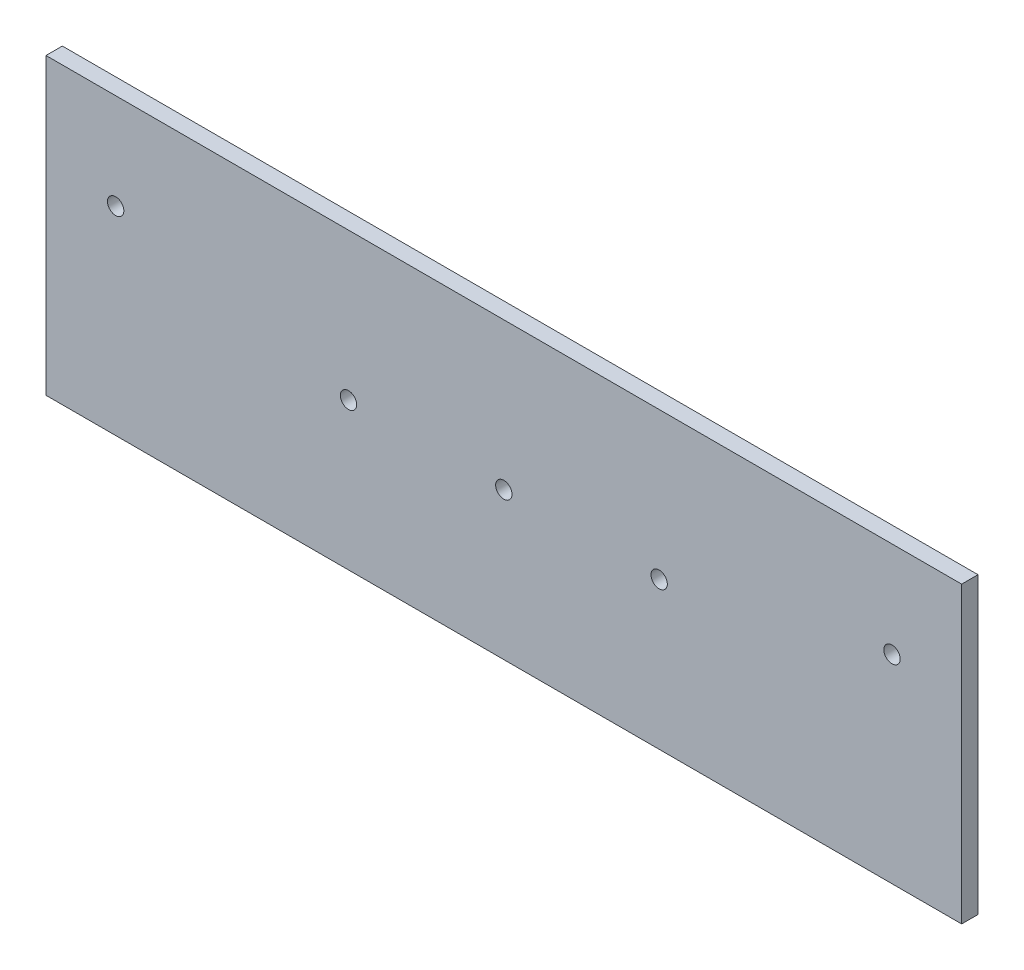
ISO-10303-21;
HEADER;
FILE_DESCRIPTION(('STEP AP214'),'2;1');
FILE_NAME('part.step','',(''),(''),'','','');
FILE_SCHEMA(('AUTOMOTIVE_DESIGN { 1 0 10303 214 1 1 1 1 }'));
ENDSEC;
DATA;
#1=APPLICATION_CONTEXT('core data for automotive mechanical design processes');
#2=APPLICATION_PROTOCOL_DEFINITION('international standard','automotive_design',2000,#1);
#3=PRODUCT_CONTEXT('',#1,'mechanical');
#4=PRODUCT('Part','Part','',(#3));
#5=PRODUCT_RELATED_PRODUCT_CATEGORY('part','',(#4));
#6=PRODUCT_DEFINITION_FORMATION('','',#4);
#7=PRODUCT_DEFINITION_CONTEXT('part definition',#1,'design');
#8=PRODUCT_DEFINITION('design','',#6,#7);
#9=PRODUCT_DEFINITION_SHAPE('','',#8);
#10=(LENGTH_UNIT() NAMED_UNIT(*) SI_UNIT(.MILLI.,.METRE.));
#11=(NAMED_UNIT(*) PLANE_ANGLE_UNIT() SI_UNIT($,.RADIAN.));
#12=(NAMED_UNIT(*) SI_UNIT($,.STERADIAN.) SOLID_ANGLE_UNIT());
#13=UNCERTAINTY_MEASURE_WITH_UNIT(LENGTH_MEASURE(1.E-05),#10,'distance_accuracy_value','');
#14=(GEOMETRIC_REPRESENTATION_CONTEXT(3) GLOBAL_UNCERTAINTY_ASSIGNED_CONTEXT((#13)) GLOBAL_UNIT_ASSIGNED_CONTEXT((#10,
#11,#12)) REPRESENTATION_CONTEXT('',''));
#15=CARTESIAN_POINT('',(0.,0.,0.));
#16=DIRECTION('',(0.,0.,1.));
#17=DIRECTION('',(1.,0.,0.));
#18=AXIS2_PLACEMENT_3D('',#15,#16,#17);
#19=CARTESIAN_POINT('',(177.8,-57.15,6.35));
#20=DIRECTION('',(-1.,0.,0.));
#21=DIRECTION('',(0.,0.,1.));
#22=AXIS2_PLACEMENT_3D('',#19,#20,#21);
#23=PLANE('',#22);
#24=DIRECTION('',(0.,1.,0.));
#25=VECTOR('',#24,1.);
#26=CARTESIAN_POINT('',(177.8,-57.15,0.));
#27=LINE('',#26,#25);
#28=CARTESIAN_POINT('',(177.8,-57.15,0.));
#29=VERTEX_POINT('',#28);
#30=CARTESIAN_POINT('',(177.8,57.15,0.));
#31=VERTEX_POINT('',#30);
#32=EDGE_CURVE('E114',#29,#31,#27,.T.);
#33=ORIENTED_EDGE('',*,*,#32,.T.);
#34=DIRECTION('',(0.,0.,-1.));
#35=VECTOR('',#34,1.);
#36=CARTESIAN_POINT('',(177.8,57.15,6.35));
#37=LINE('',#36,#35);
#38=CARTESIAN_POINT('',(177.8,57.15,6.35));
#39=VERTEX_POINT('',#38);
#40=EDGE_CURVE('E11',#39,#31,#37,.T.);
#41=ORIENTED_EDGE('',*,*,#40,.F.);
#42=DIRECTION('',(0.,1.,0.));
#43=VECTOR('',#42,1.);
#44=CARTESIAN_POINT('',(177.8,-57.15,6.35));
#45=LINE('',#44,#43);
#46=CARTESIAN_POINT('',(177.8,-57.15,6.35));
#47=VERTEX_POINT('',#46);
#48=EDGE_CURVE('E100',#47,#39,#45,.T.);
#49=ORIENTED_EDGE('',*,*,#48,.F.);
#50=DIRECTION('',(0.,0.,-1.));
#51=VECTOR('',#50,1.);
#52=CARTESIAN_POINT('',(177.8,-57.15,6.35));
#53=LINE('',#52,#51);
#54=EDGE_CURVE('E111',#47,#29,#53,.T.);
#55=ORIENTED_EDGE('',*,*,#54,.T.);
#56=EDGE_LOOP('',(#33,#41,#49,#55));
#57=FACE_BOUND('',#56,.T.);
#58=ADVANCED_FACE('F50',(#57),#23,.F.);
#59=CARTESIAN_POINT('',(-177.8,57.15,6.35));
#60=DIRECTION('',(0.,-1.,0.));
#61=DIRECTION('',(0.,0.,-1.));
#62=AXIS2_PLACEMENT_3D('',#59,#60,#61);
#63=PLANE('',#62);
#64=DIRECTION('',(-1.,0.,0.));
#65=VECTOR('',#64,1.);
#66=CARTESIAN_POINT('',(-177.8,57.15,0.));
#67=LINE('',#66,#65);
#68=CARTESIAN_POINT('',(-177.8,57.15,0.));
#69=VERTEX_POINT('',#68);
#70=EDGE_CURVE('E104',#31,#69,#67,.T.);
#71=ORIENTED_EDGE('',*,*,#70,.T.);
#72=DIRECTION('',(0.,0.,-1.));
#73=VECTOR('',#72,1.);
#74=CARTESIAN_POINT('',(-177.8,57.15,6.35));
#75=LINE('',#74,#73);
#76=CARTESIAN_POINT('',(-177.8,57.15,6.35));
#77=VERTEX_POINT('',#76);
#78=EDGE_CURVE('E57',#77,#69,#75,.T.);
#79=ORIENTED_EDGE('',*,*,#78,.F.);
#80=DIRECTION('',(-1.,0.,0.));
#81=VECTOR('',#80,1.);
#82=CARTESIAN_POINT('',(-177.8,57.15,6.35));
#83=LINE('',#82,#81);
#84=EDGE_CURVE('E93',#39,#77,#83,.T.);
#85=ORIENTED_EDGE('',*,*,#84,.F.);
#86=ORIENTED_EDGE('',*,*,#40,.T.);
#87=EDGE_LOOP('',(#71,#79,#85,#86));
#88=FACE_BOUND('',#87,.T.);
#89=ADVANCED_FACE('F101',(#88),#63,.F.);
#90=CARTESIAN_POINT('',(-177.8,-57.15,6.35));
#91=DIRECTION('',(1.,0.,0.));
#92=DIRECTION('',(0.,0.,-1.));
#93=AXIS2_PLACEMENT_3D('',#90,#91,#92);
#94=PLANE('',#93);
#95=DIRECTION('',(0.,-1.,0.));
#96=VECTOR('',#95,1.);
#97=CARTESIAN_POINT('',(-177.8,-57.15,0.));
#98=LINE('',#97,#96);
#99=CARTESIAN_POINT('',(-177.8,-57.15,0.));
#100=VERTEX_POINT('',#99);
#101=EDGE_CURVE('E81',#69,#100,#98,.T.);
#102=ORIENTED_EDGE('',*,*,#101,.T.);
#103=DIRECTION('',(0.,0.,-1.));
#104=VECTOR('',#103,1.);
#105=CARTESIAN_POINT('',(-177.8,-57.15,6.35));
#106=LINE('',#105,#104);
#107=CARTESIAN_POINT('',(-177.8,-57.15,6.35));
#108=VERTEX_POINT('',#107);
#109=EDGE_CURVE('E106',#108,#100,#106,.T.);
#110=ORIENTED_EDGE('',*,*,#109,.F.);
#111=DIRECTION('',(0.,-1.,0.));
#112=VECTOR('',#111,1.);
#113=CARTESIAN_POINT('',(-177.8,-57.15,6.35));
#114=LINE('',#113,#112);
#115=EDGE_CURVE('E97',#77,#108,#114,.T.);
#116=ORIENTED_EDGE('',*,*,#115,.F.);
#117=ORIENTED_EDGE('',*,*,#78,.T.);
#118=EDGE_LOOP('',(#102,#110,#116,#117));
#119=FACE_BOUND('',#118,.T.);
#120=ADVANCED_FACE('F110',(#119),#94,.F.);
#121=CARTESIAN_POINT('',(-177.8,-57.15,6.35));
#122=DIRECTION('',(0.,1.,0.));
#123=DIRECTION('',(0.,0.,1.));
#124=AXIS2_PLACEMENT_3D('',#121,#122,#123);
#125=PLANE('',#124);
#126=DIRECTION('',(1.,0.,0.));
#127=VECTOR('',#126,1.);
#128=CARTESIAN_POINT('',(-177.8,-57.15,0.));
#129=LINE('',#128,#127);
#130=EDGE_CURVE('E90',#100,#29,#129,.T.);
#131=ORIENTED_EDGE('',*,*,#130,.T.);
#132=ORIENTED_EDGE('',*,*,#54,.F.);
#133=DIRECTION('',(1.,0.,0.));
#134=VECTOR('',#133,1.);
#135=CARTESIAN_POINT('',(-177.8,-57.15,6.35));
#136=LINE('',#135,#134);
#137=EDGE_CURVE('E63',#108,#47,#136,.T.);
#138=ORIENTED_EDGE('',*,*,#137,.F.);
#139=ORIENTED_EDGE('',*,*,#109,.T.);
#140=EDGE_LOOP('',(#131,#132,#138,#139));
#141=FACE_BOUND('',#140,.T.);
#142=ADVANCED_FACE('F128',(#141),#125,.F.);
#143=CARTESIAN_POINT('',(0.,0.,6.35));
#144=DIRECTION('',(0.,0.,-1.));
#145=DIRECTION('',(-1.,0.,0.));
#146=AXIS2_PLACEMENT_3D('',#143,#144,#145);
#147=PLANE('',#146);
#148=CARTESIAN_POINT('',(150.749,20.,6.35));
#149=DIRECTION('',(0.,0.,-1.));
#150=DIRECTION('',(-1.,0.,0.));
#151=AXIS2_PLACEMENT_3D('',#148,#149,#150);
#152=CIRCLE('',#151,3.17500000000009);
#153=CARTESIAN_POINT('',(147.574,20.,6.35));
#154=VERTEX_POINT('',#153);
#155=EDGE_CURVE('E171',#154,#154,#152,.T.);
#156=ORIENTED_EDGE('',*,*,#155,.T.);
#157=EDGE_LOOP('',(#156));
#158=FACE_BOUND('',#157,.T.);
#159=CARTESIAN_POINT('',(60.325,0.,6.35));
#160=DIRECTION('',(0.,0.,-1.));
#161=DIRECTION('',(-1.,0.,0.));
#162=AXIS2_PLACEMENT_3D('',#159,#160,#161);
#163=CIRCLE('',#162,3.175);
#164=CARTESIAN_POINT('',(57.15,0.,6.35));
#165=VERTEX_POINT('',#164);
#166=EDGE_CURVE('E161',#165,#165,#163,.T.);
#167=ORIENTED_EDGE('',*,*,#166,.T.);
#168=EDGE_LOOP('',(#167));
#169=FACE_BOUND('',#168,.T.);
#170=CARTESIAN_POINT('',(-150.749,20.,6.35));
#171=DIRECTION('',(0.,0.,1.));
#172=DIRECTION('',(1.,0.,0.));
#173=AXIS2_PLACEMENT_3D('',#170,#171,#172);
#174=CIRCLE('',#173,3.17500000000009);
#175=CARTESIAN_POINT('',(-147.574,20.,6.35));
#176=VERTEX_POINT('',#175);
#177=EDGE_CURVE('E144',#176,#176,#174,.T.);
#178=ORIENTED_EDGE('',*,*,#177,.F.);
#179=EDGE_LOOP('',(#178));
#180=FACE_BOUND('',#179,.T.);
#181=CARTESIAN_POINT('',(0.,0.,6.35));
#182=DIRECTION('',(0.,0.,1.));
#183=DIRECTION('',(1.,0.,0.));
#184=AXIS2_PLACEMENT_3D('',#181,#182,#183);
#185=CIRCLE('',#184,3.17499999999997);
#186=CARTESIAN_POINT('',(3.17499999999997,0.,6.35));
#187=VERTEX_POINT('',#186);
#188=EDGE_CURVE('E141',#187,#187,#185,.T.);
#189=ORIENTED_EDGE('',*,*,#188,.F.);
#190=EDGE_LOOP('',(#189));
#191=FACE_BOUND('',#190,.T.);
#192=CARTESIAN_POINT('',(-60.325,0.,6.35));
#193=DIRECTION('',(0.,0.,1.));
#194=DIRECTION('',(1.,0.,0.));
#195=AXIS2_PLACEMENT_3D('',#192,#193,#194);
#196=CIRCLE('',#195,3.175);
#197=CARTESIAN_POINT('',(-57.15,0.,6.35));
#198=VERTEX_POINT('',#197);
#199=EDGE_CURVE('E138',#198,#198,#196,.T.);
#200=ORIENTED_EDGE('',*,*,#199,.F.);
#201=EDGE_LOOP('',(#200));
#202=FACE_BOUND('',#201,.T.);
#203=ORIENTED_EDGE('',*,*,#48,.T.);
#204=ORIENTED_EDGE('',*,*,#84,.T.);
#205=ORIENTED_EDGE('',*,*,#115,.T.);
#206=ORIENTED_EDGE('',*,*,#137,.T.);
#207=EDGE_LOOP('',(#203,#204,#205,#206));
#208=FACE_BOUND('',#207,.T.);
#209=ADVANCED_FACE('F94',(#158,#169,#180,#191,#202,#208),#147,.F.);
#210=CARTESIAN_POINT('',(0.,0.,0.));
#211=DIRECTION('',(0.,0.,-1.));
#212=DIRECTION('',(-1.,0.,0.));
#213=AXIS2_PLACEMENT_3D('',#210,#211,#212);
#214=PLANE('',#213);
#215=CARTESIAN_POINT('',(150.749,20.,0.));
#216=DIRECTION('',(0.,0.,-1.));
#217=DIRECTION('',(-1.,0.,0.));
#218=AXIS2_PLACEMENT_3D('',#215,#216,#217);
#219=CIRCLE('',#218,3.17500000000009);
#220=CARTESIAN_POINT('',(147.574,20.,0.));
#221=VERTEX_POINT('',#220);
#222=EDGE_CURVE('E170',#221,#221,#219,.T.);
#223=ORIENTED_EDGE('',*,*,#222,.F.);
#224=EDGE_LOOP('',(#223));
#225=FACE_BOUND('',#224,.T.);
#226=CARTESIAN_POINT('',(60.325,0.,0.));
#227=DIRECTION('',(0.,0.,-1.));
#228=DIRECTION('',(-1.,0.,0.));
#229=AXIS2_PLACEMENT_3D('',#226,#227,#228);
#230=CIRCLE('',#229,3.175);
#231=CARTESIAN_POINT('',(57.15,0.,0.));
#232=VERTEX_POINT('',#231);
#233=EDGE_CURVE('E153',#232,#232,#230,.T.);
#234=ORIENTED_EDGE('',*,*,#233,.F.);
#235=EDGE_LOOP('',(#234));
#236=FACE_BOUND('',#235,.T.);
#237=CARTESIAN_POINT('',(-150.749,20.,0.));
#238=DIRECTION('',(0.,0.,-1.));
#239=DIRECTION('',(-1.,0.,0.));
#240=AXIS2_PLACEMENT_3D('',#237,#238,#239);
#241=CIRCLE('',#240,3.17500000000009);
#242=CARTESIAN_POINT('',(-153.924,20.,0.));
#243=VERTEX_POINT('',#242);
#244=EDGE_CURVE('E148',#243,#243,#241,.F.);
#245=ORIENTED_EDGE('',*,*,#244,.T.);
#246=EDGE_LOOP('',(#245));
#247=FACE_BOUND('',#246,.T.);
#248=CARTESIAN_POINT('',(0.,0.,0.));
#249=DIRECTION('',(0.,0.,-1.));
#250=DIRECTION('',(-1.,0.,0.));
#251=AXIS2_PLACEMENT_3D('',#248,#249,#250);
#252=CIRCLE('',#251,3.17499999999997);
#253=CARTESIAN_POINT('',(-3.17499999999997,0.,0.));
#254=VERTEX_POINT('',#253);
#255=EDGE_CURVE('E147',#254,#254,#252,.F.);
#256=ORIENTED_EDGE('',*,*,#255,.T.);
#257=EDGE_LOOP('',(#256));
#258=FACE_BOUND('',#257,.T.);
#259=CARTESIAN_POINT('',(-60.325,0.,0.));
#260=DIRECTION('',(0.,0.,-1.));
#261=DIRECTION('',(-1.,0.,0.));
#262=AXIS2_PLACEMENT_3D('',#259,#260,#261);
#263=CIRCLE('',#262,3.175);
#264=CARTESIAN_POINT('',(-63.5,0.,0.));
#265=VERTEX_POINT('',#264);
#266=EDGE_CURVE('E118',#265,#265,#263,.F.);
#267=ORIENTED_EDGE('',*,*,#266,.T.);
#268=EDGE_LOOP('',(#267));
#269=FACE_BOUND('',#268,.T.);
#270=ORIENTED_EDGE('',*,*,#32,.F.);
#271=ORIENTED_EDGE('',*,*,#130,.F.);
#272=ORIENTED_EDGE('',*,*,#101,.F.);
#273=ORIENTED_EDGE('',*,*,#70,.F.);
#274=EDGE_LOOP('',(#270,#271,#272,#273));
#275=FACE_BOUND('',#274,.T.);
#276=ADVANCED_FACE('F135',(#225,#236,#247,#258,#269,#275),#214,.T.);
#277=CARTESIAN_POINT('',(-60.325,0.,-8.98025612106941));
#278=DIRECTION('',(0.,0.,1.));
#279=DIRECTION('',(1.,0.,0.));
#280=AXIS2_PLACEMENT_3D('',#277,#278,#279);
#281=CYLINDRICAL_SURFACE('',#280,3.175);
#282=ORIENTED_EDGE('',*,*,#199,.T.);
#283=EDGE_LOOP('',(#282));
#284=FACE_BOUND('',#283,.T.);
#285=ORIENTED_EDGE('',*,*,#266,.F.);
#286=EDGE_LOOP('',(#285));
#287=FACE_BOUND('',#286,.T.);
#288=ADVANCED_FACE('F190',(#284,#287),#281,.F.);
#289=CARTESIAN_POINT('',(0.,0.,-8.98025612106941));
#290=DIRECTION('',(0.,0.,1.));
#291=DIRECTION('',(1.,0.,0.));
#292=AXIS2_PLACEMENT_3D('',#289,#290,#291);
#293=CYLINDRICAL_SURFACE('',#292,3.17499999999997);
#294=ORIENTED_EDGE('',*,*,#188,.T.);
#295=EDGE_LOOP('',(#294));
#296=FACE_BOUND('',#295,.T.);
#297=ORIENTED_EDGE('',*,*,#255,.F.);
#298=EDGE_LOOP('',(#297));
#299=FACE_BOUND('',#298,.T.);
#300=ADVANCED_FACE('F198',(#296,#299),#293,.F.);
#301=CARTESIAN_POINT('',(-150.749,20.,-8.98025612106941));
#302=DIRECTION('',(0.,0.,1.));
#303=DIRECTION('',(1.,0.,0.));
#304=AXIS2_PLACEMENT_3D('',#301,#302,#303);
#305=CYLINDRICAL_SURFACE('',#304,3.17500000000009);
#306=ORIENTED_EDGE('',*,*,#177,.T.);
#307=EDGE_LOOP('',(#306));
#308=FACE_BOUND('',#307,.T.);
#309=ORIENTED_EDGE('',*,*,#244,.F.);
#310=EDGE_LOOP('',(#309));
#311=FACE_BOUND('',#310,.T.);
#312=ADVANCED_FACE('F204',(#308,#311),#305,.F.);
#313=CARTESIAN_POINT('',(60.325,0.,-8.98025612106941));
#314=DIRECTION('',(0.,0.,1.));
#315=DIRECTION('',(1.,0.,0.));
#316=AXIS2_PLACEMENT_3D('',#313,#314,#315);
#317=CYLINDRICAL_SURFACE('',#316,3.175);
#318=ORIENTED_EDGE('',*,*,#166,.F.);
#319=EDGE_LOOP('',(#318));
#320=FACE_BOUND('',#319,.T.);
#321=ORIENTED_EDGE('',*,*,#233,.T.);
#322=EDGE_LOOP('',(#321));
#323=FACE_BOUND('',#322,.T.);
#324=ADVANCED_FACE('F181',(#320,#323),#317,.F.);
#325=CARTESIAN_POINT('',(150.749,20.,-8.98025612106941));
#326=DIRECTION('',(0.,0.,1.));
#327=DIRECTION('',(1.,0.,0.));
#328=AXIS2_PLACEMENT_3D('',#325,#326,#327);
#329=CYLINDRICAL_SURFACE('',#328,3.17500000000009);
#330=ORIENTED_EDGE('',*,*,#155,.F.);
#331=EDGE_LOOP('',(#330));
#332=FACE_BOUND('',#331,.T.);
#333=ORIENTED_EDGE('',*,*,#222,.T.);
#334=EDGE_LOOP('',(#333));
#335=FACE_BOUND('',#334,.T.);
#336=ADVANCED_FACE('F178',(#332,#335),#329,.F.);
#337=CLOSED_SHELL('',(#58,#89,#120,#142,#209,#276,#288,#300,#312,#324,#336));
#338=MANIFOLD_SOLID_BREP('B2',#337);
#339=ADVANCED_BREP_SHAPE_REPRESENTATION('',(#18,#338),#14);
#340=SHAPE_DEFINITION_REPRESENTATION(#9,#339);
ENDSEC;
END-ISO-10303-21;
